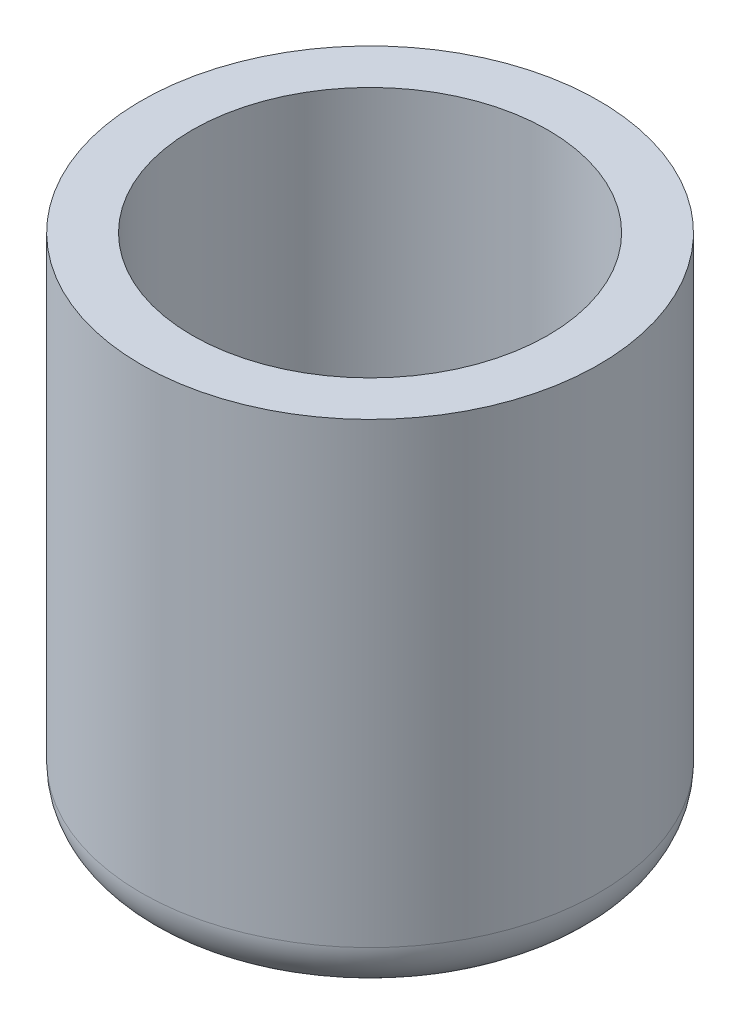
ISO-10303-21;
HEADER;
FILE_DESCRIPTION(('STEP AP214'),'2;1');
FILE_NAME('part.step','',(''),(''),'','','');
FILE_SCHEMA(('AUTOMOTIVE_DESIGN { 1 0 10303 214 1 1 1 1 }'));
ENDSEC;
DATA;
#1=APPLICATION_CONTEXT('core data for automotive mechanical design processes');
#2=APPLICATION_PROTOCOL_DEFINITION('international standard','automotive_design',2000,#1);
#3=PRODUCT_CONTEXT('',#1,'mechanical');
#4=PRODUCT('Part','Part','',(#3));
#5=PRODUCT_RELATED_PRODUCT_CATEGORY('part','',(#4));
#6=PRODUCT_DEFINITION_FORMATION('','',#4);
#7=PRODUCT_DEFINITION_CONTEXT('part definition',#1,'design');
#8=PRODUCT_DEFINITION('design','',#6,#7);
#9=PRODUCT_DEFINITION_SHAPE('','',#8);
#10=(LENGTH_UNIT() NAMED_UNIT(*) SI_UNIT(.MILLI.,.METRE.));
#11=(NAMED_UNIT(*) PLANE_ANGLE_UNIT() SI_UNIT($,.RADIAN.));
#12=(NAMED_UNIT(*) SI_UNIT($,.STERADIAN.) SOLID_ANGLE_UNIT());
#13=UNCERTAINTY_MEASURE_WITH_UNIT(LENGTH_MEASURE(1.E-05),#10,'distance_accuracy_value','');
#14=(GEOMETRIC_REPRESENTATION_CONTEXT(3) GLOBAL_UNCERTAINTY_ASSIGNED_CONTEXT((#13)) GLOBAL_UNIT_ASSIGNED_CONTEXT((#10,
#11,#12)) REPRESENTATION_CONTEXT('',''));
#15=CARTESIAN_POINT('',(0.,0.,0.));
#16=DIRECTION('',(0.,0.,1.));
#17=DIRECTION('',(1.,0.,0.));
#18=AXIS2_PLACEMENT_3D('',#15,#16,#17);
#19=CARTESIAN_POINT('',(0.,10.,0.));
#20=DIRECTION('',(0.,-1.,0.));
#21=DIRECTION('',(0.,0.,-1.));
#22=AXIS2_PLACEMENT_3D('',#19,#20,#21);
#23=CYLINDRICAL_SURFACE('',#22,4.5);
#24=CARTESIAN_POINT('',(0.,0.999999999999999,0.));
#25=DIRECTION('',(0.,1.,0.));
#26=DIRECTION('',(0.,0.,1.));
#27=AXIS2_PLACEMENT_3D('',#24,#25,#26);
#28=CIRCLE('',#27,4.5);
#29=CARTESIAN_POINT('',(0.,0.999999999999999,4.5));
#30=VERTEX_POINT('',#29);
#31=EDGE_CURVE('E45',#30,#30,#28,.T.);
#32=ORIENTED_EDGE('',*,*,#31,.T.);
#33=EDGE_LOOP('',(#32));
#34=FACE_BOUND('',#33,.T.);
#35=CARTESIAN_POINT('',(0.,10.,0.));
#36=DIRECTION('',(0.,1.,0.));
#37=DIRECTION('',(0.,0.,1.));
#38=AXIS2_PLACEMENT_3D('',#35,#36,#37);
#39=CIRCLE('',#38,4.5);
#40=CARTESIAN_POINT('',(0.,10.,4.5));
#41=VERTEX_POINT('',#40);
#42=EDGE_CURVE('E50',#41,#41,#39,.T.);
#43=ORIENTED_EDGE('',*,*,#42,.F.);
#44=EDGE_LOOP('',(#43));
#45=FACE_BOUND('',#44,.T.);
#46=ADVANCED_FACE('F37',(#34,#45),#23,.T.);
#47=CARTESIAN_POINT('',(0.,10.,0.));
#48=DIRECTION('',(0.,1.,0.));
#49=DIRECTION('',(0.,0.,1.));
#50=AXIS2_PLACEMENT_3D('',#47,#48,#49);
#51=PLANE('',#50);
#52=CARTESIAN_POINT('',(0.,10.,0.));
#53=DIRECTION('',(0.,1.,0.));
#54=DIRECTION('',(0.,0.,1.));
#55=AXIS2_PLACEMENT_3D('',#52,#53,#54);
#56=CIRCLE('',#55,3.5);
#57=CARTESIAN_POINT('',(0.,10.,3.5));
#58=VERTEX_POINT('',#57);
#59=EDGE_CURVE('E55',#58,#58,#56,.T.);
#60=ORIENTED_EDGE('',*,*,#59,.F.);
#61=EDGE_LOOP('',(#60));
#62=FACE_BOUND('',#61,.T.);
#63=ORIENTED_EDGE('',*,*,#42,.T.);
#64=EDGE_LOOP('',(#63));
#65=FACE_BOUND('',#64,.T.);
#66=ADVANCED_FACE('F79',(#62,#65),#51,.T.);
#67=CARTESIAN_POINT('',(0.,0.,0.));
#68=DIRECTION('',(0.,1.,0.));
#69=DIRECTION('',(0.,0.,1.));
#70=AXIS2_PLACEMENT_3D('',#67,#68,#69);
#71=PLANE('',#70);
#72=CARTESIAN_POINT('',(0.,0.,0.));
#73=DIRECTION('',(0.,1.,0.));
#74=DIRECTION('',(0.,0.,1.));
#75=AXIS2_PLACEMENT_3D('',#72,#73,#74);
#76=CIRCLE('',#75,3.5);
#77=CARTESIAN_POINT('',(0.,0.,3.5));
#78=VERTEX_POINT('',#77);
#79=EDGE_CURVE('E10',#78,#78,#76,.F.);
#80=ORIENTED_EDGE('',*,*,#79,.T.);
#81=EDGE_LOOP('',(#80));
#82=FACE_BOUND('',#81,.T.);
#83=CARTESIAN_POINT('',(0.,0.,0.));
#84=DIRECTION('',(0.,1.,0.));
#85=DIRECTION('',(0.,0.,1.));
#86=AXIS2_PLACEMENT_3D('',#83,#84,#85);
#87=CIRCLE('',#86,2.29128784747792);
#88=CARTESIAN_POINT('',(0.,0.,2.29128784747792));
#89=VERTEX_POINT('',#88);
#90=EDGE_CURVE('E61',#89,#89,#87,.F.);
#91=ORIENTED_EDGE('',*,*,#90,.F.);
#92=EDGE_LOOP('',(#91));
#93=FACE_BOUND('',#92,.T.);
#94=ADVANCED_FACE('F76',(#82,#93),#71,.F.);
#95=CARTESIAN_POINT('',(0.,10.,0.));
#96=DIRECTION('',(0.,-1.,0.));
#97=DIRECTION('',(0.,0.,-1.));
#98=AXIS2_PLACEMENT_3D('',#95,#96,#97);
#99=CYLINDRICAL_SURFACE('',#98,3.5);
#100=ORIENTED_EDGE('',*,*,#59,.T.);
#101=EDGE_LOOP('',(#100));
#102=FACE_BOUND('',#101,.T.);
#103=CARTESIAN_POINT('',(0.,0.999999999999999,0.));
#104=DIRECTION('',(0.,1.,0.));
#105=DIRECTION('',(0.,0.,1.));
#106=AXIS2_PLACEMENT_3D('',#103,#104,#105);
#107=CIRCLE('',#106,3.5);
#108=CARTESIAN_POINT('',(0.,0.999999999999999,3.5));
#109=VERTEX_POINT('',#108);
#110=EDGE_CURVE('E66',#109,#109,#107,.T.);
#111=ORIENTED_EDGE('',*,*,#110,.F.);
#112=EDGE_LOOP('',(#111));
#113=FACE_BOUND('',#112,.T.);
#114=ADVANCED_FACE('F78',(#102,#113),#99,.F.);
#115=CARTESIAN_POINT('',(0.,1.,0.));
#116=DIRECTION('',(0.,1.,0.));
#117=DIRECTION('',(0.,0.,1.));
#118=AXIS2_PLACEMENT_3D('',#115,#116,#117);
#119=PLANE('',#118);
#120=CARTESIAN_POINT('',(0.,1.,0.));
#121=DIRECTION('',(0.,1.,0.));
#122=DIRECTION('',(0.,0.,1.));
#123=AXIS2_PLACEMENT_3D('',#120,#121,#122);
#124=CIRCLE('',#123,2.5);
#125=CARTESIAN_POINT('',(0.,1.,2.5));
#126=VERTEX_POINT('',#125);
#127=EDGE_CURVE('E58',#126,#126,#124,.F.);
#128=ORIENTED_EDGE('',*,*,#127,.T.);
#129=EDGE_LOOP('',(#128));
#130=FACE_BOUND('',#129,.T.);
#131=ORIENTED_EDGE('',*,*,#110,.T.);
#132=EDGE_LOOP('',(#131));
#133=FACE_BOUND('',#132,.T.);
#134=ADVANCED_FACE('F85',(#130,#133),#119,.T.);
#135=CARTESIAN_POINT('',(0.,0.999999999999999,0.));
#136=DIRECTION('',(0.,1.,0.));
#137=DIRECTION('',(-1.,0.,0.));
#138=AXIS2_PLACEMENT_3D('',#135,#136,#137);
#139=SPHERICAL_SURFACE('',#138,2.5);
#140=ORIENTED_EDGE('',*,*,#127,.F.);
#141=EDGE_LOOP('',(#140));
#142=FACE_BOUND('',#141,.T.);
#143=ORIENTED_EDGE('',*,*,#90,.T.);
#144=EDGE_LOOP('',(#143));
#145=FACE_BOUND('',#144,.T.);
#146=ADVANCED_FACE('F74',(#142,#145),#139,.F.);
#147=CARTESIAN_POINT('',(0.,0.999999999999999,0.));
#148=DIRECTION('',(0.,1.,0.));
#149=DIRECTION('',(0.,0.,1.));
#150=AXIS2_PLACEMENT_3D('',#147,#148,#149);
#151=TOROIDAL_SURFACE('',#150,3.5,1.);
#152=ORIENTED_EDGE('',*,*,#79,.F.);
#153=EDGE_LOOP('',(#152));
#154=FACE_BOUND('',#153,.T.);
#155=ORIENTED_EDGE('',*,*,#31,.F.);
#156=EDGE_LOOP('',(#155));
#157=FACE_BOUND('',#156,.T.);
#158=ADVANCED_FACE('F39',(#154,#157),#151,.T.);
#159=CLOSED_SHELL('',(#46,#66,#94,#114,#134,#146,#158));
#160=MANIFOLD_SOLID_BREP('B2',#159);
#161=ADVANCED_BREP_SHAPE_REPRESENTATION('',(#18,#160),#14);
#162=SHAPE_DEFINITION_REPRESENTATION(#9,#161);
ENDSEC;
END-ISO-10303-21;
